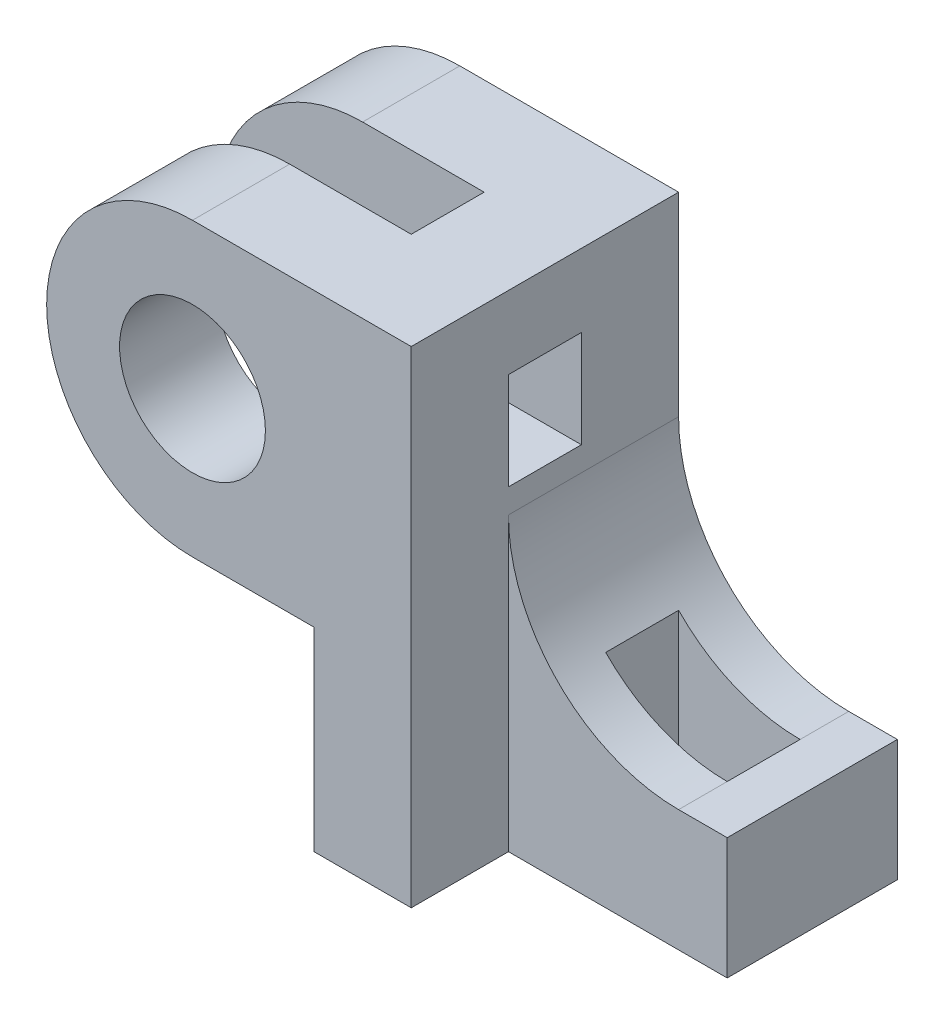
ISO-10303-21;
HEADER;
FILE_DESCRIPTION(('STEP AP214'),'2;1');
FILE_NAME('part.step','',(''),(''),'','','');
FILE_SCHEMA(('AUTOMOTIVE_DESIGN { 1 0 10303 214 1 1 1 1 }'));
ENDSEC;
DATA;
#1=APPLICATION_CONTEXT('core data for automotive mechanical design processes');
#2=APPLICATION_PROTOCOL_DEFINITION('international standard','automotive_design',2000,#1);
#3=PRODUCT_CONTEXT('',#1,'mechanical');
#4=PRODUCT('Part','Part','',(#3));
#5=PRODUCT_RELATED_PRODUCT_CATEGORY('part','',(#4));
#6=PRODUCT_DEFINITION_FORMATION('','',#4);
#7=PRODUCT_DEFINITION_CONTEXT('part definition',#1,'design');
#8=PRODUCT_DEFINITION('design','',#6,#7);
#9=PRODUCT_DEFINITION_SHAPE('','',#8);
#10=(LENGTH_UNIT() NAMED_UNIT(*) SI_UNIT(.MILLI.,.METRE.));
#11=(NAMED_UNIT(*) PLANE_ANGLE_UNIT() SI_UNIT($,.RADIAN.));
#12=(NAMED_UNIT(*) SI_UNIT($,.STERADIAN.) SOLID_ANGLE_UNIT());
#13=UNCERTAINTY_MEASURE_WITH_UNIT(LENGTH_MEASURE(1.E-05),#10,'distance_accuracy_value','');
#14=(GEOMETRIC_REPRESENTATION_CONTEXT(3) GLOBAL_UNCERTAINTY_ASSIGNED_CONTEXT((#13)) GLOBAL_UNIT_ASSIGNED_CONTEXT((#10,
#11,#12)) REPRESENTATION_CONTEXT('',''));
#15=CARTESIAN_POINT('',(0.,0.,0.));
#16=DIRECTION('',(0.,0.,1.));
#17=DIRECTION('',(1.,0.,0.));
#18=AXIS2_PLACEMENT_3D('',#15,#16,#17);
#19=CARTESIAN_POINT('',(-20.,40.,27.5));
#20=DIRECTION('',(1.,0.,0.));
#21=DIRECTION('',(0.,1.,0.));
#22=AXIS2_PLACEMENT_3D('',#19,#20,#21);
#23=PLANE('',#22);
#24=DIRECTION('',(0.,1.,0.));
#25=VECTOR('',#24,1.);
#26=CARTESIAN_POINT('',(-20.,-0.001000000000001,7.5));
#27=LINE('',#26,#25);
#28=CARTESIAN_POINT('',(-20.,40.,7.5));
#29=VERTEX_POINT('',#28);
#30=CARTESIAN_POINT('',(-20.,65.,7.5));
#31=VERTEX_POINT('',#30);
#32=EDGE_CURVE('E243',#29,#31,#27,.T.);
#33=ORIENTED_EDGE('',*,*,#32,.T.);
#34=DIRECTION('',(0.,0.,1.));
#35=VECTOR('',#34,1.);
#36=CARTESIAN_POINT('',(-20.,65.,7.5));
#37=LINE('',#36,#35);
#38=CARTESIAN_POINT('',(-20.,65.,-7.5));
#39=VERTEX_POINT('',#38);
#40=EDGE_CURVE('E187',#39,#31,#37,.T.);
#41=ORIENTED_EDGE('',*,*,#40,.F.);
#42=DIRECTION('',(0.,1.,0.));
#43=VECTOR('',#42,1.);
#44=CARTESIAN_POINT('',(-20.,-0.001000000000001,-7.5));
#45=LINE('',#44,#43);
#46=CARTESIAN_POINT('',(-20.,40.,-7.5));
#47=VERTEX_POINT('',#46);
#48=EDGE_CURVE('E248',#47,#39,#45,.T.);
#49=ORIENTED_EDGE('',*,*,#48,.F.);
#50=DIRECTION('',(0.,0.,-1.));
#51=VECTOR('',#50,1.);
#52=CARTESIAN_POINT('',(-20.,40.,27.5));
#53=LINE('',#52,#51);
#54=CARTESIAN_POINT('',(-20.,40.,-27.5));
#55=VERTEX_POINT('',#54);
#56=EDGE_CURVE('E292',#47,#55,#53,.T.);
#57=ORIENTED_EDGE('',*,*,#56,.T.);
#58=DIRECTION('',(0.,-1.,0.));
#59=VECTOR('',#58,1.);
#60=CARTESIAN_POINT('',(-20.,40.,-27.5));
#61=LINE('',#60,#59);
#62=CARTESIAN_POINT('',(-20.,0.,-27.5));
#63=VERTEX_POINT('',#62);
#64=EDGE_CURVE('E266',#55,#63,#61,.T.);
#65=ORIENTED_EDGE('',*,*,#64,.T.);
#66=DIRECTION('',(0.,0.,-1.));
#67=VECTOR('',#66,1.);
#68=CARTESIAN_POINT('',(-20.,0.,27.5));
#69=LINE('',#68,#67);
#70=CARTESIAN_POINT('',(-20.,0.,27.5));
#71=VERTEX_POINT('',#70);
#72=EDGE_CURVE('E276',#71,#63,#69,.T.);
#73=ORIENTED_EDGE('',*,*,#72,.F.);
#74=DIRECTION('',(0.,-1.,0.));
#75=VECTOR('',#74,1.);
#76=CARTESIAN_POINT('',(-20.,40.,27.5));
#77=LINE('',#76,#75);
#78=CARTESIAN_POINT('',(-20.,40.,27.5));
#79=VERTEX_POINT('',#78);
#80=EDGE_CURVE('E274',#79,#71,#77,.T.);
#81=ORIENTED_EDGE('',*,*,#80,.F.);
#82=EDGE_CURVE('E293',#79,#29,#53,.T.);
#83=ORIENTED_EDGE('',*,*,#82,.T.);
#84=EDGE_LOOP('',(#33,#41,#49,#57,#65,#73,#81,#83));
#85=FACE_BOUND('',#84,.T.);
#86=ADVANCED_FACE('F33',(#85),#23,.F.);
#87=CARTESIAN_POINT('',(0.,0.,27.5));
#88=DIRECTION('',(-1.,0.,0.));
#89=DIRECTION('',(0.,0.,1.));
#90=AXIS2_PLACEMENT_3D('',#87,#88,#89);
#91=PLANE('',#90);
#92=DIRECTION('',(0.,0.,1.));
#93=VECTOR('',#92,1.);
#94=CARTESIAN_POINT('',(0.,85.,7.5));
#95=LINE('',#94,#93);
#96=CARTESIAN_POINT('',(0.,85.,-7.5));
#97=VERTEX_POINT('',#96);
#98=CARTESIAN_POINT('',(0.,85.,7.5));
#99=VERTEX_POINT('',#98);
#100=EDGE_CURVE('E447',#97,#99,#95,.T.);
#101=ORIENTED_EDGE('',*,*,#100,.F.);
#102=DIRECTION('',(0.,1.,0.));
#103=VECTOR('',#102,1.);
#104=CARTESIAN_POINT('',(0.,65.,-7.5));
#105=LINE('',#104,#103);
#106=CARTESIAN_POINT('',(0.,65.,-7.5));
#107=VERTEX_POINT('',#106);
#108=EDGE_CURVE('E433',#107,#97,#105,.T.);
#109=ORIENTED_EDGE('',*,*,#108,.F.);
#110=DIRECTION('',(0.,0.,-1.));
#111=VECTOR('',#110,1.);
#112=CARTESIAN_POINT('',(0.,65.,7.5));
#113=LINE('',#112,#111);
#114=CARTESIAN_POINT('',(0.,65.,7.5));
#115=VERTEX_POINT('',#114);
#116=EDGE_CURVE('E439',#115,#107,#113,.T.);
#117=ORIENTED_EDGE('',*,*,#116,.F.);
#118=DIRECTION('',(0.,-1.,0.));
#119=VECTOR('',#118,1.);
#120=CARTESIAN_POINT('',(0.,65.,7.5));
#121=LINE('',#120,#119);
#122=EDGE_CURVE('E443',#99,#115,#121,.T.);
#123=ORIENTED_EDGE('',*,*,#122,.F.);
#124=EDGE_LOOP('',(#101,#109,#117,#123));
#125=FACE_BOUND('',#124,.T.);
#126=DIRECTION('',(0.,0.,-1.));
#127=VECTOR('',#126,1.);
#128=CARTESIAN_POINT('',(0.,60.,7.5));
#129=LINE('',#128,#127);
#130=CARTESIAN_POINT('',(0.,60.,7.5));
#131=VERTEX_POINT('',#130);
#132=CARTESIAN_POINT('',(0.,60.,-27.5));
#133=VERTEX_POINT('',#132);
#134=EDGE_CURVE('E216',#131,#133,#129,.T.);
#135=ORIENTED_EDGE('',*,*,#134,.T.);
#136=DIRECTION('',(0.,1.,0.));
#137=VECTOR('',#136,1.);
#138=CARTESIAN_POINT('',(0.,0.,-27.5));
#139=LINE('',#138,#137);
#140=CARTESIAN_POINT('',(0.,100.,-27.5));
#141=VERTEX_POINT('',#140);
#142=EDGE_CURVE('E278',#133,#141,#139,.T.);
#143=ORIENTED_EDGE('',*,*,#142,.T.);
#144=DIRECTION('',(0.,0.,-1.));
#145=VECTOR('',#144,1.);
#146=CARTESIAN_POINT('',(0.,100.,27.5));
#147=LINE('',#146,#145);
#148=CARTESIAN_POINT('',(0.,100.,27.5));
#149=VERTEX_POINT('',#148);
#150=EDGE_CURVE('E41',#149,#141,#147,.T.);
#151=ORIENTED_EDGE('',*,*,#150,.F.);
#152=DIRECTION('',(0.,1.,0.));
#153=VECTOR('',#152,1.);
#154=CARTESIAN_POINT('',(0.,0.,27.5));
#155=LINE('',#154,#153);
#156=CARTESIAN_POINT('',(0.,0.,27.5));
#157=VERTEX_POINT('',#156);
#158=EDGE_CURVE('E265',#157,#149,#155,.T.);
#159=ORIENTED_EDGE('',*,*,#158,.F.);
#160=DIRECTION('',(0.,0.,-1.));
#161=VECTOR('',#160,1.);
#162=CARTESIAN_POINT('',(0.,0.,27.5));
#163=LINE('',#162,#161);
#164=CARTESIAN_POINT('',(0.,0.,7.5));
#165=VERTEX_POINT('',#164);
#166=EDGE_CURVE('E11',#157,#165,#163,.T.);
#167=ORIENTED_EDGE('',*,*,#166,.T.);
#168=DIRECTION('',(0.,1.,0.));
#169=VECTOR('',#168,1.);
#170=CARTESIAN_POINT('',(0.,0.,7.5));
#171=LINE('',#170,#169);
#172=EDGE_CURVE('E355',#165,#131,#171,.T.);
#173=ORIENTED_EDGE('',*,*,#172,.T.);
#174=EDGE_LOOP('',(#135,#143,#151,#159,#167,#173));
#175=FACE_BOUND('',#174,.T.);
#176=ADVANCED_FACE('F353',(#125,#175),#91,.F.);
#177=CARTESIAN_POINT('',(-45.,70.,27.5));
#178=DIRECTION('',(0.,0.,-1.));
#179=DIRECTION('',(-1.,0.,0.));
#180=AXIS2_PLACEMENT_3D('',#177,#178,#179);
#181=CYLINDRICAL_SURFACE('',#180,30.);
#182=DIRECTION('',(0.,0.,-1.));
#183=VECTOR('',#182,1.);
#184=CARTESIAN_POINT('',(-45.,100.,27.5));
#185=LINE('',#184,#183);
#186=CARTESIAN_POINT('',(-45.,100.,27.5));
#187=VERTEX_POINT('',#186);
#188=CARTESIAN_POINT('',(-45.,100.,7.5));
#189=VERTEX_POINT('',#188);
#190=EDGE_CURVE('E301',#187,#189,#185,.T.);
#191=ORIENTED_EDGE('',*,*,#190,.T.);
#192=CARTESIAN_POINT('',(-45.,70.,7.5));
#193=DIRECTION('',(0.,0.,1.));
#194=DIRECTION('',(1.,0.,0.));
#195=AXIS2_PLACEMENT_3D('',#192,#193,#194);
#196=CIRCLE('',#195,30.);
#197=CARTESIAN_POINT('',(-45.,40.,7.5));
#198=VERTEX_POINT('',#197);
#199=EDGE_CURVE('E226',#198,#189,#196,.F.);
#200=ORIENTED_EDGE('',*,*,#199,.F.);
#201=DIRECTION('',(0.,0.,-1.));
#202=VECTOR('',#201,1.);
#203=CARTESIAN_POINT('',(-45.,40.,27.5));
#204=LINE('',#203,#202);
#205=CARTESIAN_POINT('',(-45.,40.,27.5));
#206=VERTEX_POINT('',#205);
#207=EDGE_CURVE('E297',#206,#198,#204,.T.);
#208=ORIENTED_EDGE('',*,*,#207,.F.);
#209=CARTESIAN_POINT('',(-45.,70.,27.5));
#210=DIRECTION('',(0.,0.,1.));
#211=DIRECTION('',(1.,0.,0.));
#212=AXIS2_PLACEMENT_3D('',#209,#210,#211);
#213=CIRCLE('',#212,30.);
#214=EDGE_CURVE('E270',#187,#206,#213,.T.);
#215=ORIENTED_EDGE('',*,*,#214,.F.);
#216=EDGE_LOOP('',(#191,#200,#208,#215));
#217=FACE_BOUND('',#216,.T.);
#218=ADVANCED_FACE('F344',(#217),#181,.T.);
#219=CARTESIAN_POINT('',(-45.,40.,27.5));
#220=DIRECTION('',(0.,1.,0.));
#221=DIRECTION('',(0.,0.,1.));
#222=AXIS2_PLACEMENT_3D('',#219,#220,#221);
#223=PLANE('',#222);
#224=ORIENTED_EDGE('',*,*,#207,.T.);
#225=DIRECTION('',(-1.,0.,0.));
#226=VECTOR('',#225,1.);
#227=CARTESIAN_POINT('',(-75.,40.,7.5));
#228=LINE('',#227,#226);
#229=EDGE_CURVE('E232',#29,#198,#228,.T.);
#230=ORIENTED_EDGE('',*,*,#229,.F.);
#231=ORIENTED_EDGE('',*,*,#82,.F.);
#232=DIRECTION('',(1.,0.,0.));
#233=VECTOR('',#232,1.);
#234=CARTESIAN_POINT('',(-45.,40.,27.5));
#235=LINE('',#234,#233);
#236=EDGE_CURVE('E272',#206,#79,#235,.T.);
#237=ORIENTED_EDGE('',*,*,#236,.F.);
#238=EDGE_LOOP('',(#224,#230,#231,#237));
#239=FACE_BOUND('',#238,.T.);
#240=ADVANCED_FACE('F413',(#239),#223,.F.);
#241=CARTESIAN_POINT('',(-45.,70.,27.5));
#242=DIRECTION('',(0.,0.,-1.));
#243=DIRECTION('',(-1.,0.,0.));
#244=AXIS2_PLACEMENT_3D('',#241,#242,#243);
#245=CYLINDRICAL_SURFACE('',#244,15.);
#246=CARTESIAN_POINT('',(-45.,70.,7.5));
#247=DIRECTION('',(0.,0.,1.));
#248=DIRECTION('',(1.,0.,0.));
#249=AXIS2_PLACEMENT_3D('',#246,#247,#248);
#250=CIRCLE('',#249,15.);
#251=CARTESIAN_POINT('',(-30.,70.,7.5));
#252=VERTEX_POINT('',#251);
#253=EDGE_CURVE('E229',#252,#252,#250,.F.);
#254=ORIENTED_EDGE('',*,*,#253,.T.);
#255=EDGE_LOOP('',(#254));
#256=FACE_BOUND('',#255,.T.);
#257=CARTESIAN_POINT('',(-45.,70.,27.5));
#258=DIRECTION('',(0.,0.,1.));
#259=DIRECTION('',(1.,0.,0.));
#260=AXIS2_PLACEMENT_3D('',#257,#258,#259);
#261=CIRCLE('',#260,15.);
#262=CARTESIAN_POINT('',(-30.,70.,27.5));
#263=VERTEX_POINT('',#262);
#264=EDGE_CURVE('E256',#263,#263,#261,.T.);
#265=ORIENTED_EDGE('',*,*,#264,.T.);
#266=EDGE_LOOP('',(#265));
#267=FACE_BOUND('',#266,.T.);
#268=ADVANCED_FACE('F411',(#256,#267),#245,.F.);
#269=CARTESIAN_POINT('',(-45.,70.,27.5));
#270=DIRECTION('',(0.,0.,1.));
#271=DIRECTION('',(1.,0.,0.));
#272=AXIS2_PLACEMENT_3D('',#269,#270,#271);
#273=PLANE('',#272);
#274=DIRECTION('',(1.,0.,0.));
#275=VECTOR('',#274,1.);
#276=CARTESIAN_POINT('',(-20.,0.,27.5));
#277=LINE('',#276,#275);
#278=EDGE_CURVE('E262',#71,#157,#277,.T.);
#279=ORIENTED_EDGE('',*,*,#278,.T.);
#280=ORIENTED_EDGE('',*,*,#158,.T.);
#281=DIRECTION('',(-1.,0.,0.));
#282=VECTOR('',#281,1.);
#283=CARTESIAN_POINT('',(0.,100.,27.5));
#284=LINE('',#283,#282);
#285=EDGE_CURVE('E268',#149,#187,#284,.T.);
#286=ORIENTED_EDGE('',*,*,#285,.T.);
#287=ORIENTED_EDGE('',*,*,#214,.T.);
#288=ORIENTED_EDGE('',*,*,#236,.T.);
#289=ORIENTED_EDGE('',*,*,#80,.T.);
#290=EDGE_LOOP('',(#279,#280,#286,#287,#288,#289));
#291=FACE_BOUND('',#290,.T.);
#292=ORIENTED_EDGE('',*,*,#264,.F.);
#293=EDGE_LOOP('',(#292));
#294=FACE_BOUND('',#293,.T.);
#295=ADVANCED_FACE('F348',(#291,#294),#273,.T.);
#296=CARTESIAN_POINT('',(-45.,70.,-27.5));
#297=DIRECTION('',(0.,0.,1.));
#298=DIRECTION('',(1.,0.,0.));
#299=AXIS2_PLACEMENT_3D('',#296,#297,#298);
#300=PLANE('',#299);
#301=DIRECTION('',(1.,0.,0.));
#302=VECTOR('',#301,1.);
#303=CARTESIAN_POINT('',(-20.,0.,-27.5));
#304=LINE('',#303,#302);
#305=CARTESIAN_POINT('',(45.,0.,-27.5));
#306=VERTEX_POINT('',#305);
#307=EDGE_CURVE('E259',#63,#306,#304,.T.);
#308=ORIENTED_EDGE('',*,*,#307,.F.);
#309=ORIENTED_EDGE('',*,*,#64,.F.);
#310=DIRECTION('',(1.,0.,0.));
#311=VECTOR('',#310,1.);
#312=CARTESIAN_POINT('',(-45.,40.,-27.5));
#313=LINE('',#312,#311);
#314=CARTESIAN_POINT('',(-45.,40.,-27.5));
#315=VERTEX_POINT('',#314);
#316=EDGE_CURVE('E286',#315,#55,#313,.T.);
#317=ORIENTED_EDGE('',*,*,#316,.F.);
#318=CARTESIAN_POINT('',(-45.,70.,-27.5));
#319=DIRECTION('',(0.,0.,1.));
#320=DIRECTION('',(1.,0.,0.));
#321=AXIS2_PLACEMENT_3D('',#318,#319,#320);
#322=CIRCLE('',#321,30.);
#323=CARTESIAN_POINT('',(-45.,100.,-27.5));
#324=VERTEX_POINT('',#323);
#325=EDGE_CURVE('E283',#324,#315,#322,.T.);
#326=ORIENTED_EDGE('',*,*,#325,.F.);
#327=DIRECTION('',(-1.,0.,0.));
#328=VECTOR('',#327,1.);
#329=CARTESIAN_POINT('',(0.,100.,-27.5));
#330=LINE('',#329,#328);
#331=EDGE_CURVE('E280',#141,#324,#330,.T.);
#332=ORIENTED_EDGE('',*,*,#331,.F.);
#333=ORIENTED_EDGE('',*,*,#142,.F.);
#334=CARTESIAN_POINT('',(35.,60.,-27.5));
#335=DIRECTION('',(0.,0.,1.));
#336=DIRECTION('',(-1.,0.,0.));
#337=AXIS2_PLACEMENT_3D('',#334,#335,#336);
#338=CIRCLE('',#337,35.);
#339=CARTESIAN_POINT('',(35.,25.,-27.5));
#340=VERTEX_POINT('',#339);
#341=EDGE_CURVE('E376',#133,#340,#338,.T.);
#342=ORIENTED_EDGE('',*,*,#341,.T.);
#343=DIRECTION('',(1.,0.,0.));
#344=VECTOR('',#343,1.);
#345=CARTESIAN_POINT('',(45.,25.,-27.5));
#346=LINE('',#345,#344);
#347=CARTESIAN_POINT('',(45.,25.,-27.5));
#348=VERTEX_POINT('',#347);
#349=EDGE_CURVE('E367',#340,#348,#346,.T.);
#350=ORIENTED_EDGE('',*,*,#349,.T.);
#351=DIRECTION('',(0.,-1.,0.));
#352=VECTOR('',#351,1.);
#353=CARTESIAN_POINT('',(45.,25.,-27.5));
#354=LINE('',#353,#352);
#355=EDGE_CURVE('E373',#348,#306,#354,.T.);
#356=ORIENTED_EDGE('',*,*,#355,.T.);
#357=EDGE_LOOP('',(#308,#309,#317,#326,#332,#333,#342,#350,#356));
#358=FACE_BOUND('',#357,.T.);
#359=CARTESIAN_POINT('',(-45.,70.,-27.5));
#360=DIRECTION('',(0.,0.,1.));
#361=DIRECTION('',(1.,0.,0.));
#362=AXIS2_PLACEMENT_3D('',#359,#360,#361);
#363=CIRCLE('',#362,15.);
#364=CARTESIAN_POINT('',(-30.,70.,-27.5));
#365=VERTEX_POINT('',#364);
#366=EDGE_CURVE('E255',#365,#365,#363,.T.);
#367=ORIENTED_EDGE('',*,*,#366,.T.);
#368=EDGE_LOOP('',(#367));
#369=FACE_BOUND('',#368,.T.);
#370=ADVANCED_FACE('F316',(#358,#369),#300,.F.);
#371=CARTESIAN_POINT('',(-20.,0.,27.5));
#372=DIRECTION('',(0.,1.,0.));
#373=DIRECTION('',(0.,0.,1.));
#374=AXIS2_PLACEMENT_3D('',#371,#372,#373);
#375=PLANE('',#374);
#376=DIRECTION('',(-1.,0.,0.));
#377=VECTOR('',#376,1.);
#378=CARTESIAN_POINT('',(9.99999999999999,0.,-2.5));
#379=LINE('',#378,#377);
#380=CARTESIAN_POINT('',(35.,0.,-2.5));
#381=VERTEX_POINT('',#380);
#382=CARTESIAN_POINT('',(9.99999999999999,0.,-2.5));
#383=VERTEX_POINT('',#382);
#384=EDGE_CURVE('E617',#381,#383,#379,.T.);
#385=ORIENTED_EDGE('',*,*,#384,.F.);
#386=DIRECTION('',(0.,0.,1.));
#387=VECTOR('',#386,1.);
#388=CARTESIAN_POINT('',(35.,0.,-17.5));
#389=LINE('',#388,#387);
#390=CARTESIAN_POINT('',(35.,0.,-17.5));
#391=VERTEX_POINT('',#390);
#392=EDGE_CURVE('E48',#391,#381,#389,.T.);
#393=ORIENTED_EDGE('',*,*,#392,.F.);
#394=DIRECTION('',(1.,0.,0.));
#395=VECTOR('',#394,1.);
#396=CARTESIAN_POINT('',(9.99999999999999,0.,-17.5));
#397=LINE('',#396,#395);
#398=CARTESIAN_POINT('',(9.99999999999999,0.,-17.5));
#399=VERTEX_POINT('',#398);
#400=EDGE_CURVE('E194',#399,#391,#397,.T.);
#401=ORIENTED_EDGE('',*,*,#400,.F.);
#402=DIRECTION('',(0.,0.,-1.));
#403=VECTOR('',#402,1.);
#404=CARTESIAN_POINT('',(9.99999999999999,0.,-17.5));
#405=LINE('',#404,#403);
#406=EDGE_CURVE('E620',#383,#399,#405,.T.);
#407=ORIENTED_EDGE('',*,*,#406,.F.);
#408=EDGE_LOOP('',(#385,#393,#401,#407));
#409=FACE_BOUND('',#408,.T.);
#410=ORIENTED_EDGE('',*,*,#307,.T.);
#411=DIRECTION('',(0.,0.,-1.));
#412=VECTOR('',#411,1.);
#413=CARTESIAN_POINT('',(45.,0.,7.5));
#414=LINE('',#413,#412);
#415=CARTESIAN_POINT('',(45.,0.,7.5));
#416=VERTEX_POINT('',#415);
#417=EDGE_CURVE('E221',#416,#306,#414,.T.);
#418=ORIENTED_EDGE('',*,*,#417,.F.);
#419=DIRECTION('',(-1.,0.,0.));
#420=VECTOR('',#419,1.);
#421=CARTESIAN_POINT('',(45.,0.,7.5));
#422=LINE('',#421,#420);
#423=EDGE_CURVE('E362',#416,#165,#422,.T.);
#424=ORIENTED_EDGE('',*,*,#423,.T.);
#425=ORIENTED_EDGE('',*,*,#166,.F.);
#426=ORIENTED_EDGE('',*,*,#278,.F.);
#427=ORIENTED_EDGE('',*,*,#72,.T.);
#428=EDGE_LOOP('',(#410,#418,#424,#425,#426,#427));
#429=FACE_BOUND('',#428,.T.);
#430=ADVANCED_FACE('F35',(#409,#429),#375,.F.);
#431=CARTESIAN_POINT('',(0.,100.,27.5));
#432=DIRECTION('',(0.,-1.,0.));
#433=DIRECTION('',(0.,0.,-1.));
#434=AXIS2_PLACEMENT_3D('',#431,#432,#433);
#435=PLANE('',#434);
#436=DIRECTION('',(0.,0.,-1.));
#437=VECTOR('',#436,1.);
#438=CARTESIAN_POINT('',(-20.,100.,-7.5));
#439=LINE('',#438,#437);
#440=CARTESIAN_POINT('',(-20.,100.,7.5));
#441=VERTEX_POINT('',#440);
#442=CARTESIAN_POINT('',(-20.,100.,-7.5));
#443=VERTEX_POINT('',#442);
#444=EDGE_CURVE('E234',#441,#443,#439,.T.);
#445=ORIENTED_EDGE('',*,*,#444,.F.);
#446=DIRECTION('',(1.,0.,0.));
#447=VECTOR('',#446,1.);
#448=CARTESIAN_POINT('',(-75.,100.,7.5));
#449=LINE('',#448,#447);
#450=EDGE_CURVE('E239',#189,#441,#449,.T.);
#451=ORIENTED_EDGE('',*,*,#450,.F.);
#452=ORIENTED_EDGE('',*,*,#190,.F.);
#453=ORIENTED_EDGE('',*,*,#285,.F.);
#454=ORIENTED_EDGE('',*,*,#150,.T.);
#455=ORIENTED_EDGE('',*,*,#331,.T.);
#456=CARTESIAN_POINT('',(-45.,100.,-7.5));
#457=VERTEX_POINT('',#456);
#458=EDGE_CURVE('E300',#457,#324,#185,.T.);
#459=ORIENTED_EDGE('',*,*,#458,.F.);
#460=DIRECTION('',(-1.,0.,0.));
#461=VECTOR('',#460,1.);
#462=CARTESIAN_POINT('',(-75.,100.,-7.5));
#463=LINE('',#462,#461);
#464=EDGE_CURVE('E237',#443,#457,#463,.T.);
#465=ORIENTED_EDGE('',*,*,#464,.F.);
#466=EDGE_LOOP('',(#445,#451,#452,#453,#454,#455,#459,#465));
#467=FACE_BOUND('',#466,.T.);
#468=ADVANCED_FACE('F309',(#467),#435,.F.);
#469=CARTESIAN_POINT('',(-45.,40.,-7.5));
#470=VERTEX_POINT('',#469);
#471=EDGE_CURVE('E296',#470,#315,#204,.T.);
#472=ORIENTED_EDGE('',*,*,#471,.F.);
#473=CARTESIAN_POINT('',(-45.,70.,-7.5));
#474=DIRECTION('',(0.,0.,-1.));
#475=DIRECTION('',(-1.,0.,0.));
#476=AXIS2_PLACEMENT_3D('',#473,#474,#475);
#477=CIRCLE('',#476,30.);
#478=EDGE_CURVE('E214',#457,#470,#477,.F.);
#479=ORIENTED_EDGE('',*,*,#478,.F.);
#480=ORIENTED_EDGE('',*,*,#458,.T.);
#481=ORIENTED_EDGE('',*,*,#325,.T.);
#482=EDGE_LOOP('',(#472,#479,#480,#481));
#483=FACE_BOUND('',#482,.T.);
#484=ADVANCED_FACE('F323',(#483),#181,.T.);
#485=ORIENTED_EDGE('',*,*,#56,.F.);
#486=DIRECTION('',(1.,0.,0.));
#487=VECTOR('',#486,1.);
#488=CARTESIAN_POINT('',(-75.,40.,-7.5));
#489=LINE('',#488,#487);
#490=EDGE_CURVE('E246',#470,#47,#489,.T.);
#491=ORIENTED_EDGE('',*,*,#490,.F.);
#492=ORIENTED_EDGE('',*,*,#471,.T.);
#493=ORIENTED_EDGE('',*,*,#316,.T.);
#494=EDGE_LOOP('',(#485,#491,#492,#493));
#495=FACE_BOUND('',#494,.T.);
#496=ADVANCED_FACE('F404',(#495),#223,.F.);
#497=CARTESIAN_POINT('',(-20.,85.,-7.5));
#498=VERTEX_POINT('',#497);
#499=EDGE_CURVE('E242',#498,#443,#45,.T.);
#500=ORIENTED_EDGE('',*,*,#499,.F.);
#501=DIRECTION('',(0.,0.,-1.));
#502=VECTOR('',#501,1.);
#503=CARTESIAN_POINT('',(-20.,85.,7.5));
#504=LINE('',#503,#502);
#505=CARTESIAN_POINT('',(-20.,85.,7.5));
#506=VERTEX_POINT('',#505);
#507=EDGE_CURVE('E338',#506,#498,#504,.T.);
#508=ORIENTED_EDGE('',*,*,#507,.F.);
#509=EDGE_CURVE('E247',#506,#441,#27,.T.);
#510=ORIENTED_EDGE('',*,*,#509,.T.);
#511=ORIENTED_EDGE('',*,*,#444,.T.);
#512=EDGE_LOOP('',(#500,#508,#510,#511));
#513=FACE_BOUND('',#512,.T.);
#514=ADVANCED_FACE('F336',(#513),#23,.F.);
#515=CARTESIAN_POINT('',(-45.,70.,-7.5));
#516=DIRECTION('',(0.,0.,-1.));
#517=DIRECTION('',(-1.,0.,0.));
#518=AXIS2_PLACEMENT_3D('',#515,#516,#517);
#519=CIRCLE('',#518,15.);
#520=CARTESIAN_POINT('',(-60.,70.,-7.5));
#521=VERTEX_POINT('',#520);
#522=EDGE_CURVE('E228',#521,#521,#519,.F.);
#523=ORIENTED_EDGE('',*,*,#522,.T.);
#524=EDGE_LOOP('',(#523));
#525=FACE_BOUND('',#524,.T.);
#526=ORIENTED_EDGE('',*,*,#366,.F.);
#527=EDGE_LOOP('',(#526));
#528=FACE_BOUND('',#527,.T.);
#529=ADVANCED_FACE('F403',(#525,#528),#245,.F.);
#530=CARTESIAN_POINT('',(-75.,-0.001000000000001,7.5));
#531=DIRECTION('',(0.,0.,1.));
#532=DIRECTION('',(1.,0.,0.));
#533=AXIS2_PLACEMENT_3D('',#530,#531,#532);
#534=PLANE('',#533);
#535=ORIENTED_EDGE('',*,*,#253,.F.);
#536=EDGE_LOOP('',(#535));
#537=FACE_BOUND('',#536,.T.);
#538=ORIENTED_EDGE('',*,*,#450,.T.);
#539=ORIENTED_EDGE('',*,*,#509,.F.);
#540=DIRECTION('',(1.,0.,0.));
#541=VECTOR('',#540,1.);
#542=CARTESIAN_POINT('',(-75.001,85.,7.5));
#543=LINE('',#542,#541);
#544=EDGE_CURVE('E454',#506,#99,#543,.T.);
#545=ORIENTED_EDGE('',*,*,#544,.T.);
#546=ORIENTED_EDGE('',*,*,#122,.T.);
#547=DIRECTION('',(1.,0.,0.));
#548=VECTOR('',#547,1.);
#549=CARTESIAN_POINT('',(-75.001,65.,7.5));
#550=LINE('',#549,#548);
#551=EDGE_CURVE('E436',#31,#115,#550,.T.);
#552=ORIENTED_EDGE('',*,*,#551,.F.);
#553=ORIENTED_EDGE('',*,*,#32,.F.);
#554=ORIENTED_EDGE('',*,*,#229,.T.);
#555=ORIENTED_EDGE('',*,*,#199,.T.);
#556=EDGE_LOOP('',(#538,#539,#545,#546,#552,#553,#554,#555));
#557=FACE_BOUND('',#556,.T.);
#558=ADVANCED_FACE('F340',(#537,#557),#534,.F.);
#559=CARTESIAN_POINT('',(-75.,-0.001000000000001,-7.5));
#560=DIRECTION('',(0.,0.,-1.));
#561=DIRECTION('',(-1.,0.,0.));
#562=AXIS2_PLACEMENT_3D('',#559,#560,#561);
#563=PLANE('',#562);
#564=ORIENTED_EDGE('',*,*,#522,.F.);
#565=EDGE_LOOP('',(#564));
#566=FACE_BOUND('',#565,.T.);
#567=ORIENTED_EDGE('',*,*,#478,.T.);
#568=ORIENTED_EDGE('',*,*,#490,.T.);
#569=ORIENTED_EDGE('',*,*,#48,.T.);
#570=DIRECTION('',(1.,0.,0.));
#571=VECTOR('',#570,1.);
#572=CARTESIAN_POINT('',(-75.001,65.,-7.5));
#573=LINE('',#572,#571);
#574=EDGE_CURVE('E430',#39,#107,#573,.T.);
#575=ORIENTED_EDGE('',*,*,#574,.T.);
#576=ORIENTED_EDGE('',*,*,#108,.T.);
#577=DIRECTION('',(1.,0.,0.));
#578=VECTOR('',#577,1.);
#579=CARTESIAN_POINT('',(-75.001,85.,-7.5));
#580=LINE('',#579,#578);
#581=EDGE_CURVE('E333',#498,#97,#580,.T.);
#582=ORIENTED_EDGE('',*,*,#581,.F.);
#583=ORIENTED_EDGE('',*,*,#499,.T.);
#584=ORIENTED_EDGE('',*,*,#464,.T.);
#585=EDGE_LOOP('',(#567,#568,#569,#575,#576,#582,#583,#584));
#586=FACE_BOUND('',#585,.T.);
#587=ADVANCED_FACE('F328',(#566,#586),#563,.F.);
#588=CARTESIAN_POINT('',(45.,25.,7.5));
#589=DIRECTION('',(1.,0.,0.));
#590=DIRECTION('',(0.,0.,-1.));
#591=AXIS2_PLACEMENT_3D('',#588,#589,#590);
#592=PLANE('',#591);
#593=ORIENTED_EDGE('',*,*,#355,.F.);
#594=DIRECTION('',(0.,0.,-1.));
#595=VECTOR('',#594,1.);
#596=CARTESIAN_POINT('',(45.,25.,7.5));
#597=LINE('',#596,#595);
#598=CARTESIAN_POINT('',(45.,25.,7.5));
#599=VERTEX_POINT('',#598);
#600=EDGE_CURVE('E212',#599,#348,#597,.T.);
#601=ORIENTED_EDGE('',*,*,#600,.F.);
#602=DIRECTION('',(0.,-1.,0.));
#603=VECTOR('',#602,1.);
#604=CARTESIAN_POINT('',(45.,25.,7.5));
#605=LINE('',#604,#603);
#606=EDGE_CURVE('E365',#599,#416,#605,.T.);
#607=ORIENTED_EDGE('',*,*,#606,.T.);
#608=ORIENTED_EDGE('',*,*,#417,.T.);
#609=EDGE_LOOP('',(#593,#601,#607,#608));
#610=FACE_BOUND('',#609,.T.);
#611=ADVANCED_FACE('F381',(#610),#592,.T.);
#612=CARTESIAN_POINT('',(45.,25.,7.5));
#613=DIRECTION('',(0.,1.,0.));
#614=DIRECTION('',(0.,0.,1.));
#615=AXIS2_PLACEMENT_3D('',#612,#613,#614);
#616=PLANE('',#615);
#617=ORIENTED_EDGE('',*,*,#349,.F.);
#618=DIRECTION('',(0.,0.,-1.));
#619=VECTOR('',#618,1.);
#620=CARTESIAN_POINT('',(35.,25.,7.5));
#621=LINE('',#620,#619);
#622=CARTESIAN_POINT('',(35.,25.,-17.5));
#623=VERTEX_POINT('',#622);
#624=EDGE_CURVE('E203',#623,#340,#621,.T.);
#625=ORIENTED_EDGE('',*,*,#624,.F.);
#626=DIRECTION('',(0.,0.,-1.));
#627=VECTOR('',#626,1.);
#628=CARTESIAN_POINT('',(35.,25.,7.5));
#629=LINE('',#628,#627);
#630=CARTESIAN_POINT('',(35.,25.,-2.5));
#631=VERTEX_POINT('',#630);
#632=EDGE_CURVE('E192',#631,#623,#629,.T.);
#633=ORIENTED_EDGE('',*,*,#632,.F.);
#634=CARTESIAN_POINT('',(35.,25.,7.5));
#635=VERTEX_POINT('',#634);
#636=EDGE_CURVE('E201',#635,#631,#621,.T.);
#637=ORIENTED_EDGE('',*,*,#636,.F.);
#638=DIRECTION('',(1.,0.,0.));
#639=VECTOR('',#638,1.);
#640=CARTESIAN_POINT('',(45.,25.,7.5));
#641=LINE('',#640,#639);
#642=EDGE_CURVE('E224',#635,#599,#641,.T.);
#643=ORIENTED_EDGE('',*,*,#642,.T.);
#644=ORIENTED_EDGE('',*,*,#600,.T.);
#645=EDGE_LOOP('',(#617,#625,#633,#637,#643,#644));
#646=FACE_BOUND('',#645,.T.);
#647=ADVANCED_FACE('F199',(#646),#616,.T.);
#648=CARTESIAN_POINT('',(35.,60.,7.5));
#649=DIRECTION('',(0.,0.,-1.));
#650=DIRECTION('',(-1.,0.,0.));
#651=AXIS2_PLACEMENT_3D('',#648,#649,#650);
#652=CYLINDRICAL_SURFACE('',#651,35.);
#653=CARTESIAN_POINT('',(35.,60.,-17.5));
#654=DIRECTION('',(0.,0.,-1.));
#655=DIRECTION('',(-1.,0.,0.));
#656=AXIS2_PLACEMENT_3D('',#653,#654,#655);
#657=CIRCLE('',#656,35.);
#658=CARTESIAN_POINT('',(9.99999999999999,35.5051025721682,-17.5));
#659=VERTEX_POINT('',#658);
#660=EDGE_CURVE('E623',#659,#623,#657,.F.);
#661=ORIENTED_EDGE('',*,*,#660,.T.);
#662=ORIENTED_EDGE('',*,*,#624,.T.);
#663=ORIENTED_EDGE('',*,*,#341,.F.);
#664=ORIENTED_EDGE('',*,*,#134,.F.);
#665=CARTESIAN_POINT('',(35.,60.,7.5));
#666=DIRECTION('',(0.,0.,1.));
#667=DIRECTION('',(-1.,0.,0.));
#668=AXIS2_PLACEMENT_3D('',#665,#666,#667);
#669=CIRCLE('',#668,35.);
#670=EDGE_CURVE('E210',#131,#635,#669,.T.);
#671=ORIENTED_EDGE('',*,*,#670,.T.);
#672=ORIENTED_EDGE('',*,*,#636,.T.);
#673=CARTESIAN_POINT('',(35.,60.,-2.5));
#674=DIRECTION('',(0.,0.,1.));
#675=DIRECTION('',(1.,0.,0.));
#676=AXIS2_PLACEMENT_3D('',#673,#674,#675);
#677=CIRCLE('',#676,35.);
#678=CARTESIAN_POINT('',(9.99999999999999,35.5051025721682,-2.5));
#679=VERTEX_POINT('',#678);
#680=EDGE_CURVE('E180',#631,#679,#677,.F.);
#681=ORIENTED_EDGE('',*,*,#680,.T.);
#682=DIRECTION('',(0.,0.,-1.));
#683=VECTOR('',#682,1.);
#684=CARTESIAN_POINT('',(9.99999999999999,35.5051025721682,7.5));
#685=LINE('',#684,#683);
#686=EDGE_CURVE('E204',#679,#659,#685,.T.);
#687=ORIENTED_EDGE('',*,*,#686,.T.);
#688=EDGE_LOOP('',(#661,#662,#663,#664,#671,#672,#681,#687));
#689=FACE_BOUND('',#688,.T.);
#690=ADVANCED_FACE('F207',(#689),#652,.F.);
#691=CARTESIAN_POINT('',(35.,60.,7.5));
#692=DIRECTION('',(0.,0.,-1.));
#693=DIRECTION('',(-1.,0.,0.));
#694=AXIS2_PLACEMENT_3D('',#691,#692,#693);
#695=PLANE('',#694);
#696=ORIENTED_EDGE('',*,*,#606,.F.);
#697=ORIENTED_EDGE('',*,*,#642,.F.);
#698=ORIENTED_EDGE('',*,*,#670,.F.);
#699=ORIENTED_EDGE('',*,*,#172,.F.);
#700=ORIENTED_EDGE('',*,*,#423,.F.);
#701=EDGE_LOOP('',(#696,#697,#698,#699,#700));
#702=FACE_BOUND('',#701,.T.);
#703=ADVANCED_FACE('F361',(#702),#695,.F.);
#704=CARTESIAN_POINT('',(-75.001,65.,7.5));
#705=DIRECTION('',(0.,-1.,0.));
#706=DIRECTION('',(0.,0.,-1.));
#707=AXIS2_PLACEMENT_3D('',#704,#705,#706);
#708=PLANE('',#707);
#709=ORIENTED_EDGE('',*,*,#40,.T.);
#710=ORIENTED_EDGE('',*,*,#551,.T.);
#711=ORIENTED_EDGE('',*,*,#116,.T.);
#712=ORIENTED_EDGE('',*,*,#574,.F.);
#713=EDGE_LOOP('',(#709,#710,#711,#712));
#714=FACE_BOUND('',#713,.T.);
#715=ADVANCED_FACE('F440',(#714),#708,.F.);
#716=CARTESIAN_POINT('',(-75.001,85.,7.5));
#717=DIRECTION('',(0.,1.,0.));
#718=DIRECTION('',(0.,0.,1.));
#719=AXIS2_PLACEMENT_3D('',#716,#717,#718);
#720=PLANE('',#719);
#721=ORIENTED_EDGE('',*,*,#507,.T.);
#722=ORIENTED_EDGE('',*,*,#581,.T.);
#723=ORIENTED_EDGE('',*,*,#100,.T.);
#724=ORIENTED_EDGE('',*,*,#544,.F.);
#725=EDGE_LOOP('',(#721,#722,#723,#724));
#726=FACE_BOUND('',#725,.T.);
#727=ADVANCED_FACE('F457',(#726),#720,.F.);
#728=CARTESIAN_POINT('',(35.,100.001,-17.5));
#729=DIRECTION('',(1.,0.,0.));
#730=DIRECTION('',(0.,0.,-1.));
#731=AXIS2_PLACEMENT_3D('',#728,#729,#730);
#732=PLANE('',#731);
#733=DIRECTION('',(0.,-1.,0.));
#734=VECTOR('',#733,1.);
#735=CARTESIAN_POINT('',(35.,100.001,-17.5));
#736=LINE('',#735,#734);
#737=EDGE_CURVE('E188',#623,#391,#736,.T.);
#738=ORIENTED_EDGE('',*,*,#737,.T.);
#739=ORIENTED_EDGE('',*,*,#392,.T.);
#740=DIRECTION('',(0.,-1.,0.));
#741=VECTOR('',#740,1.);
#742=CARTESIAN_POINT('',(35.,100.001,-2.5));
#743=LINE('',#742,#741);
#744=EDGE_CURVE('E182',#631,#381,#743,.T.);
#745=ORIENTED_EDGE('',*,*,#744,.F.);
#746=ORIENTED_EDGE('',*,*,#632,.T.);
#747=EDGE_LOOP('',(#738,#739,#745,#746));
#748=FACE_BOUND('',#747,.T.);
#749=ADVANCED_FACE('F191',(#748),#732,.F.);
#750=CARTESIAN_POINT('',(9.99999999999999,100.001,-17.5));
#751=DIRECTION('',(0.,0.,-1.));
#752=DIRECTION('',(-1.,0.,0.));
#753=AXIS2_PLACEMENT_3D('',#750,#751,#752);
#754=PLANE('',#753);
#755=DIRECTION('',(0.,-1.,0.));
#756=VECTOR('',#755,1.);
#757=CARTESIAN_POINT('',(9.99999999999999,100.001,-17.5));
#758=LINE('',#757,#756);
#759=EDGE_CURVE('E630',#659,#399,#758,.T.);
#760=ORIENTED_EDGE('',*,*,#759,.T.);
#761=ORIENTED_EDGE('',*,*,#400,.T.);
#762=ORIENTED_EDGE('',*,*,#737,.F.);
#763=ORIENTED_EDGE('',*,*,#660,.F.);
#764=EDGE_LOOP('',(#760,#761,#762,#763));
#765=FACE_BOUND('',#764,.T.);
#766=ADVANCED_FACE('F464',(#765),#754,.F.);
#767=CARTESIAN_POINT('',(9.99999999999999,100.001,-17.5));
#768=DIRECTION('',(-1.,0.,0.));
#769=DIRECTION('',(0.,0.,1.));
#770=AXIS2_PLACEMENT_3D('',#767,#768,#769);
#771=PLANE('',#770);
#772=DIRECTION('',(0.,-1.,0.));
#773=VECTOR('',#772,1.);
#774=CARTESIAN_POINT('',(9.99999999999999,100.001,-2.5));
#775=LINE('',#774,#773);
#776=EDGE_CURVE('E56',#679,#383,#775,.T.);
#777=ORIENTED_EDGE('',*,*,#776,.T.);
#778=ORIENTED_EDGE('',*,*,#406,.T.);
#779=ORIENTED_EDGE('',*,*,#759,.F.);
#780=ORIENTED_EDGE('',*,*,#686,.F.);
#781=EDGE_LOOP('',(#777,#778,#779,#780));
#782=FACE_BOUND('',#781,.T.);
#783=ADVANCED_FACE('F633',(#782),#771,.F.);
#784=CARTESIAN_POINT('',(9.99999999999999,100.001,-2.5));
#785=DIRECTION('',(0.,0.,1.));
#786=DIRECTION('',(1.,0.,0.));
#787=AXIS2_PLACEMENT_3D('',#784,#785,#786);
#788=PLANE('',#787);
#789=ORIENTED_EDGE('',*,*,#744,.T.);
#790=ORIENTED_EDGE('',*,*,#384,.T.);
#791=ORIENTED_EDGE('',*,*,#776,.F.);
#792=ORIENTED_EDGE('',*,*,#680,.F.);
#793=EDGE_LOOP('',(#789,#790,#791,#792));
#794=FACE_BOUND('',#793,.T.);
#795=ADVANCED_FACE('F181',(#794),#788,.F.);
#796=CLOSED_SHELL('',(#86,#176,#218,#240,#268,#295,#370,#430,#468,#484,#496,#514,#529,#558,#587,
#611,#647,#690,#703,#715,#727,#749,#766,#783,#795));
#797=MANIFOLD_SOLID_BREP('B2',#796);
#798=ADVANCED_BREP_SHAPE_REPRESENTATION('',(#18,#797),#14);
#799=SHAPE_DEFINITION_REPRESENTATION(#9,#798);
ENDSEC;
END-ISO-10303-21;
